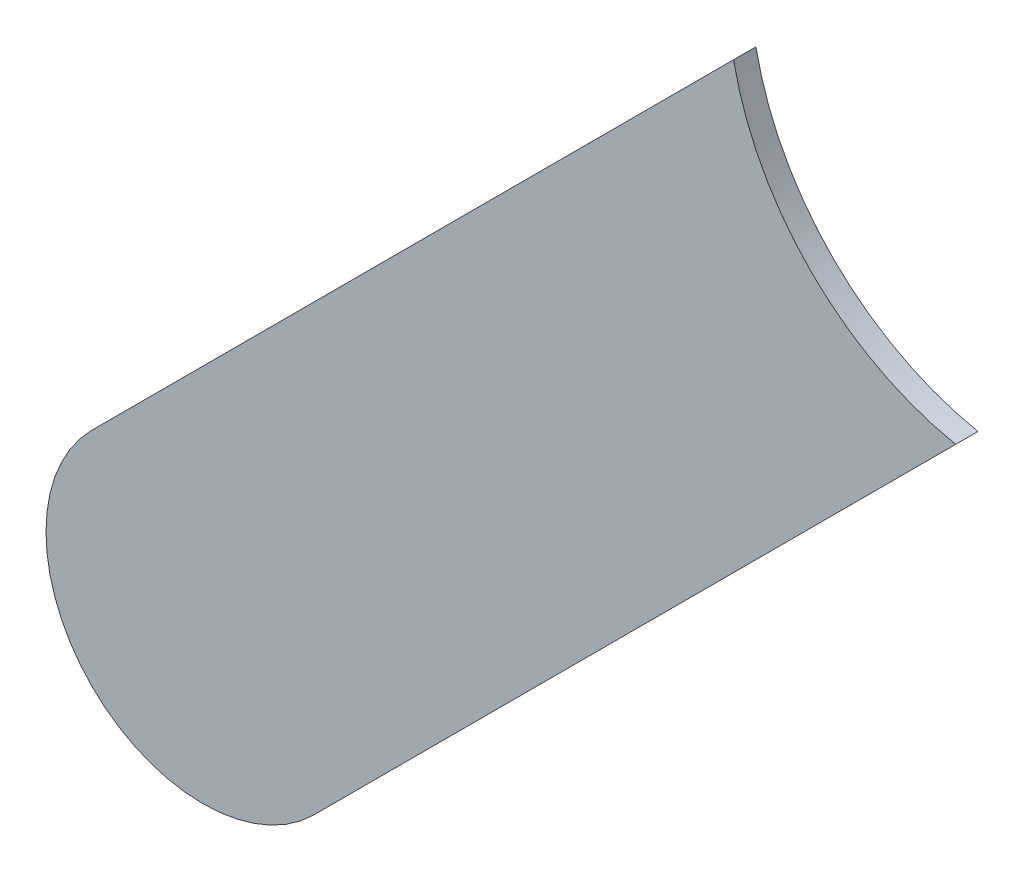
ISO-10303-21;
HEADER;
FILE_DESCRIPTION(('STEP AP214'),'2;1');
FILE_NAME('part.step','',(''),(''),'','','');
FILE_SCHEMA(('AUTOMOTIVE_DESIGN { 1 0 10303 214 1 1 1 1 }'));
ENDSEC;
DATA;
#1=APPLICATION_CONTEXT('core data for automotive mechanical design processes');
#2=APPLICATION_PROTOCOL_DEFINITION('international standard','automotive_design',2000,#1);
#3=PRODUCT_CONTEXT('',#1,'mechanical');
#4=PRODUCT('Part','Part','',(#3));
#5=PRODUCT_RELATED_PRODUCT_CATEGORY('part','',(#4));
#6=PRODUCT_DEFINITION_FORMATION('','',#4);
#7=PRODUCT_DEFINITION_CONTEXT('part definition',#1,'design');
#8=PRODUCT_DEFINITION('design','',#6,#7);
#9=PRODUCT_DEFINITION_SHAPE('','',#8);
#10=(LENGTH_UNIT() NAMED_UNIT(*) SI_UNIT(.MILLI.,.METRE.));
#11=(NAMED_UNIT(*) PLANE_ANGLE_UNIT() SI_UNIT($,.RADIAN.));
#12=(NAMED_UNIT(*) SI_UNIT($,.STERADIAN.) SOLID_ANGLE_UNIT());
#13=UNCERTAINTY_MEASURE_WITH_UNIT(LENGTH_MEASURE(1.E-05),#10,'distance_accuracy_value','');
#14=(GEOMETRIC_REPRESENTATION_CONTEXT(3) GLOBAL_UNCERTAINTY_ASSIGNED_CONTEXT((#13)) GLOBAL_UNIT_ASSIGNED_CONTEXT((#10,
#11,#12)) REPRESENTATION_CONTEXT('',''));
#15=CARTESIAN_POINT('',(0.,0.,0.));
#16=DIRECTION('',(0.,0.,1.));
#17=DIRECTION('',(1.,0.,0.));
#18=AXIS2_PLACEMENT_3D('',#15,#16,#17);
#19=CARTESIAN_POINT('',(49.54178052,100.32523496,0.));
#20=DIRECTION('',(-0.70710678118655,0.707106781186546,0.));
#21=DIRECTION('',(0.707106781186546,0.70710678118655,0.));
#22=AXIS2_PLACEMENT_3D('',#19,#20,#21);
#23=PLANE('',#22);
#24=DIRECTION('',(0.707106781186546,0.70710678118655,0.));
#25=VECTOR('',#24,1.);
#26=CARTESIAN_POINT('',(49.54178052,100.32523496,0.03556));
#27=LINE('',#26,#25);
#28=CARTESIAN_POINT('',(49.54178052,100.32523496,0.03556));
#29=VERTEX_POINT('',#28);
#30=CARTESIAN_POINT('',(50.5632054036052,101.346659843605,0.03556));
#31=VERTEX_POINT('',#30);
#32=EDGE_CURVE('E11',#29,#31,#27,.T.);
#33=ORIENTED_EDGE('',*,*,#32,.F.);
#34=DIRECTION('',(0.,0.,1.));
#35=VECTOR('',#34,1.);
#36=CARTESIAN_POINT('',(49.54178052,100.32523496,0.));
#37=LINE('',#36,#35);
#38=CARTESIAN_POINT('',(49.54178052,100.32523496,0.));
#39=VERTEX_POINT('',#38);
#40=EDGE_CURVE('E24',#39,#29,#37,.T.);
#41=ORIENTED_EDGE('',*,*,#40,.F.);
#42=DIRECTION('',(0.707106781186546,0.70710678118655,0.));
#43=VECTOR('',#42,1.);
#44=CARTESIAN_POINT('',(49.54178052,100.32523496,0.));
#45=LINE('',#44,#43);
#46=CARTESIAN_POINT('',(50.5632054036052,101.346659843605,0.));
#47=VERTEX_POINT('',#46);
#48=EDGE_CURVE('E75',#39,#47,#45,.T.);
#49=ORIENTED_EDGE('',*,*,#48,.T.);
#50=DIRECTION('',(0.,0.,1.));
#51=VECTOR('',#50,1.);
#52=CARTESIAN_POINT('',(50.5632054036052,101.346659843605,0.));
#53=LINE('',#52,#51);
#54=EDGE_CURVE('E37',#47,#31,#53,.T.);
#55=ORIENTED_EDGE('',*,*,#54,.T.);
#56=EDGE_LOOP('',(#33,#41,#49,#55));
#57=FACE_BOUND('',#56,.T.);
#58=ADVANCED_FACE('F17',(#57),#23,.F.);
#59=CARTESIAN_POINT('',(50.6510036,101.7880108,0.));
#60=DIRECTION('',(0.,0.,-1.));
#61=DIRECTION('',(1.,0.,0.));
#62=AXIS2_PLACEMENT_3D('',#59,#60,#61);
#63=CYLINDRICAL_SURFACE('',#62,0.4499991);
#64=DIRECTION('',(0.,0.,1.));
#65=VECTOR('',#64,1.);
#66=CARTESIAN_POINT('',(50.2096526436052,101.700212603605,0.));
#67=LINE('',#66,#65);
#68=CARTESIAN_POINT('',(50.2096526436052,101.700212603605,0.));
#69=VERTEX_POINT('',#68);
#70=CARTESIAN_POINT('',(50.2096526436052,101.700212603605,0.03556));
#71=VERTEX_POINT('',#70);
#72=EDGE_CURVE('E67',#69,#71,#67,.T.);
#73=ORIENTED_EDGE('',*,*,#72,.T.);
#74=CARTESIAN_POINT('',(50.6510036,101.7880108,0.03556));
#75=DIRECTION('',(0.,0.,1.));
#76=DIRECTION('',(1.,0.,0.));
#77=AXIS2_PLACEMENT_3D('',#74,#75,#76);
#78=CIRCLE('',#77,0.4499991);
#79=EDGE_CURVE('E82',#71,#31,#78,.T.);
#80=ORIENTED_EDGE('',*,*,#79,.T.);
#81=ORIENTED_EDGE('',*,*,#54,.F.);
#82=CARTESIAN_POINT('',(50.6510036,101.7880108,0.));
#83=DIRECTION('',(0.,0.,1.));
#84=DIRECTION('',(1.,0.,0.));
#85=AXIS2_PLACEMENT_3D('',#82,#83,#84);
#86=CIRCLE('',#85,0.4499991);
#87=EDGE_CURVE('E80',#69,#47,#86,.T.);
#88=ORIENTED_EDGE('',*,*,#87,.F.);
#89=EDGE_LOOP('',(#73,#80,#81,#88));
#90=FACE_BOUND('',#89,.T.);
#91=ADVANCED_FACE('F88',(#90),#63,.F.);
#92=CARTESIAN_POINT('',(50.2096526436052,101.700212603605,0.));
#93=DIRECTION('',(0.707106781186546,-0.70710678118655,0.));
#94=DIRECTION('',(-0.70710678118655,-0.707106781186546,0.));
#95=AXIS2_PLACEMENT_3D('',#92,#93,#94);
#96=PLANE('',#95);
#97=DIRECTION('',(-0.70710678118655,-0.707106781186546,0.));
#98=VECTOR('',#97,1.);
#99=CARTESIAN_POINT('',(50.47422722,101.96478718,0.03556));
#100=LINE('',#99,#98);
#101=CARTESIAN_POINT('',(49.18822776,100.67878772,0.03556));
#102=VERTEX_POINT('',#101);
#103=EDGE_CURVE('E71',#71,#102,#100,.T.);
#104=ORIENTED_EDGE('',*,*,#103,.F.);
#105=ORIENTED_EDGE('',*,*,#72,.F.);
#106=DIRECTION('',(-0.70710678118655,-0.707106781186546,0.));
#107=VECTOR('',#106,1.);
#108=CARTESIAN_POINT('',(50.47422722,101.96478718,0.));
#109=LINE('',#108,#107);
#110=CARTESIAN_POINT('',(49.18822776,100.67878772,0.));
#111=VERTEX_POINT('',#110);
#112=EDGE_CURVE('E63',#69,#111,#109,.T.);
#113=ORIENTED_EDGE('',*,*,#112,.T.);
#114=DIRECTION('',(0.,0.,1.));
#115=VECTOR('',#114,1.);
#116=CARTESIAN_POINT('',(49.18822776,100.67878772,0.));
#117=LINE('',#116,#115);
#118=EDGE_CURVE('E53',#111,#102,#117,.T.);
#119=ORIENTED_EDGE('',*,*,#118,.T.);
#120=EDGE_LOOP('',(#104,#105,#113,#119));
#121=FACE_BOUND('',#120,.T.);
#122=ADVANCED_FACE('F66',(#121),#96,.F.);
#123=CARTESIAN_POINT('',(49.36500414,100.50201134,0.));
#124=DIRECTION('',(0.,0.,-1.));
#125=DIRECTION('',(-0.707106781186533,0.707106781186562,0.));
#126=AXIS2_PLACEMENT_3D('',#123,#124,#125);
#127=CYLINDRICAL_SURFACE('',#126,0.249999554103226);
#128=CARTESIAN_POINT('',(49.36500414,100.50201134,0.03556));
#129=DIRECTION('',(0.,0.,1.));
#130=DIRECTION('',(-0.707106781186533,0.707106781186562,0.));
#131=AXIS2_PLACEMENT_3D('',#128,#129,#130);
#132=CIRCLE('',#131,0.249999554103226);
#133=EDGE_CURVE('E59',#102,#29,#132,.T.);
#134=ORIENTED_EDGE('',*,*,#133,.F.);
#135=ORIENTED_EDGE('',*,*,#118,.F.);
#136=CARTESIAN_POINT('',(49.36500414,100.50201134,0.));
#137=DIRECTION('',(0.,0.,1.));
#138=DIRECTION('',(-0.707106781186533,0.707106781186562,0.));
#139=AXIS2_PLACEMENT_3D('',#136,#137,#138);
#140=CIRCLE('',#139,0.249999554103226);
#141=EDGE_CURVE('E57',#111,#39,#140,.T.);
#142=ORIENTED_EDGE('',*,*,#141,.T.);
#143=ORIENTED_EDGE('',*,*,#40,.T.);
#144=EDGE_LOOP('',(#134,#135,#142,#143));
#145=FACE_BOUND('',#144,.T.);
#146=ADVANCED_FACE('F55',(#145),#127,.T.);
#147=CARTESIAN_POINT('',(49.54178052,100.32523496,0.));
#148=DIRECTION('',(0.,0.,-1.));
#149=DIRECTION('',(-1.,0.,0.));
#150=AXIS2_PLACEMENT_3D('',#147,#148,#149);
#151=PLANE('',#150);
#152=ORIENTED_EDGE('',*,*,#48,.F.);
#153=ORIENTED_EDGE('',*,*,#141,.F.);
#154=ORIENTED_EDGE('',*,*,#112,.F.);
#155=ORIENTED_EDGE('',*,*,#87,.T.);
#156=EDGE_LOOP('',(#152,#153,#154,#155));
#157=FACE_BOUND('',#156,.T.);
#158=ADVANCED_FACE('F74',(#157),#151,.T.);
#159=CARTESIAN_POINT('',(49.54178052,100.32523496,0.03556));
#160=DIRECTION('',(0.,0.,-1.));
#161=DIRECTION('',(-1.,0.,0.));
#162=AXIS2_PLACEMENT_3D('',#159,#160,#161);
#163=PLANE('',#162);
#164=ORIENTED_EDGE('',*,*,#133,.T.);
#165=ORIENTED_EDGE('',*,*,#32,.T.);
#166=ORIENTED_EDGE('',*,*,#79,.F.);
#167=ORIENTED_EDGE('',*,*,#103,.T.);
#168=EDGE_LOOP('',(#164,#165,#166,#167));
#169=FACE_BOUND('',#168,.T.);
#170=ADVANCED_FACE('F91',(#169),#163,.F.);
#171=CLOSED_SHELL('',(#58,#91,#122,#146,#158,#170));
#172=MANIFOLD_SOLID_BREP('B1',#171);
#173=ADVANCED_BREP_SHAPE_REPRESENTATION('',(#18,#172),#14);
#174=SHAPE_DEFINITION_REPRESENTATION(#9,#173);
ENDSEC;
END-ISO-10303-21;
